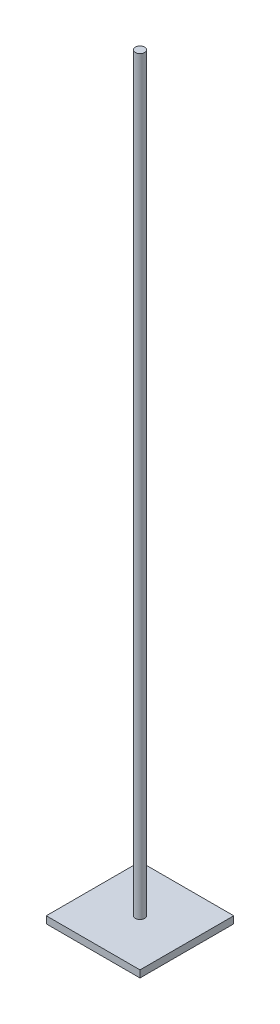
ISO-10303-21;
HEADER;
FILE_DESCRIPTION(('STEP AP214'),'2;1');
FILE_NAME('part.step','',(''),(''),'','','');
FILE_SCHEMA(('AUTOMOTIVE_DESIGN { 1 0 10303 214 1 1 1 1 }'));
ENDSEC;
DATA;
#1=APPLICATION_CONTEXT('core data for automotive mechanical design processes');
#2=APPLICATION_PROTOCOL_DEFINITION('international standard','automotive_design',2000,#1);
#3=PRODUCT_CONTEXT('',#1,'mechanical');
#4=PRODUCT('Part','Part','',(#3));
#5=PRODUCT_RELATED_PRODUCT_CATEGORY('part','',(#4));
#6=PRODUCT_DEFINITION_FORMATION('','',#4);
#7=PRODUCT_DEFINITION_CONTEXT('part definition',#1,'design');
#8=PRODUCT_DEFINITION('design','',#6,#7);
#9=PRODUCT_DEFINITION_SHAPE('','',#8);
#10=(LENGTH_UNIT() NAMED_UNIT(*) SI_UNIT(.MILLI.,.METRE.));
#11=(NAMED_UNIT(*) PLANE_ANGLE_UNIT() SI_UNIT($,.RADIAN.));
#12=(NAMED_UNIT(*) SI_UNIT($,.STERADIAN.) SOLID_ANGLE_UNIT());
#13=UNCERTAINTY_MEASURE_WITH_UNIT(LENGTH_MEASURE(1.E-05),#10,'distance_accuracy_value','');
#14=(GEOMETRIC_REPRESENTATION_CONTEXT(3) GLOBAL_UNCERTAINTY_ASSIGNED_CONTEXT((#13)) GLOBAL_UNIT_ASSIGNED_CONTEXT((#10,
#11,#12)) REPRESENTATION_CONTEXT('',''));
#15=CARTESIAN_POINT('',(0.,0.,0.));
#16=DIRECTION('',(0.,0.,1.));
#17=DIRECTION('',(1.,0.,0.));
#18=AXIS2_PLACEMENT_3D('',#15,#16,#17);
#19=CARTESIAN_POINT('',(100.,15.,100.));
#20=DIRECTION('',(-1.,0.,0.));
#21=DIRECTION('',(0.,0.,1.));
#22=AXIS2_PLACEMENT_3D('',#19,#20,#21);
#23=PLANE('',#22);
#24=DIRECTION('',(0.,0.,-1.));
#25=VECTOR('',#24,1.);
#26=CARTESIAN_POINT('',(100.,0.,100.));
#27=LINE('',#26,#25);
#28=CARTESIAN_POINT('',(100.,0.,100.));
#29=VERTEX_POINT('',#28);
#30=CARTESIAN_POINT('',(100.,0.,-100.));
#31=VERTEX_POINT('',#30);
#32=EDGE_CURVE('E99',#29,#31,#27,.T.);
#33=ORIENTED_EDGE('',*,*,#32,.T.);
#34=DIRECTION('',(0.,-1.,0.));
#35=VECTOR('',#34,1.);
#36=CARTESIAN_POINT('',(100.,15.,-100.));
#37=LINE('',#36,#35);
#38=CARTESIAN_POINT('',(100.,15.,-100.));
#39=VERTEX_POINT('',#38);
#40=EDGE_CURVE('E41',#39,#31,#37,.T.);
#41=ORIENTED_EDGE('',*,*,#40,.F.);
#42=DIRECTION('',(0.,0.,-1.));
#43=VECTOR('',#42,1.);
#44=CARTESIAN_POINT('',(100.,15.,100.));
#45=LINE('',#44,#43);
#46=CARTESIAN_POINT('',(100.,15.,100.));
#47=VERTEX_POINT('',#46);
#48=EDGE_CURVE('E85',#47,#39,#45,.T.);
#49=ORIENTED_EDGE('',*,*,#48,.F.);
#50=DIRECTION('',(0.,-1.,0.));
#51=VECTOR('',#50,1.);
#52=CARTESIAN_POINT('',(100.,15.,100.));
#53=LINE('',#52,#51);
#54=EDGE_CURVE('E95',#47,#29,#53,.T.);
#55=ORIENTED_EDGE('',*,*,#54,.T.);
#56=EDGE_LOOP('',(#33,#41,#49,#55));
#57=FACE_BOUND('',#56,.T.);
#58=ADVANCED_FACE('F33',(#57),#23,.F.);
#59=CARTESIAN_POINT('',(-100.,15.,-100.));
#60=DIRECTION('',(0.,0.,1.));
#61=DIRECTION('',(1.,0.,0.));
#62=AXIS2_PLACEMENT_3D('',#59,#60,#61);
#63=PLANE('',#62);
#64=DIRECTION('',(-1.,0.,0.));
#65=VECTOR('',#64,1.);
#66=CARTESIAN_POINT('',(-100.,0.,-100.));
#67=LINE('',#66,#65);
#68=CARTESIAN_POINT('',(-100.,0.,-100.));
#69=VERTEX_POINT('',#68);
#70=EDGE_CURVE('E90',#31,#69,#67,.T.);
#71=ORIENTED_EDGE('',*,*,#70,.T.);
#72=DIRECTION('',(0.,-1.,0.));
#73=VECTOR('',#72,1.);
#74=CARTESIAN_POINT('',(-100.,15.,-100.));
#75=LINE('',#74,#73);
#76=CARTESIAN_POINT('',(-100.,15.,-100.));
#77=VERTEX_POINT('',#76);
#78=EDGE_CURVE('E88',#77,#69,#75,.T.);
#79=ORIENTED_EDGE('',*,*,#78,.F.);
#80=DIRECTION('',(-1.,0.,0.));
#81=VECTOR('',#80,1.);
#82=CARTESIAN_POINT('',(-100.,15.,-100.));
#83=LINE('',#82,#81);
#84=EDGE_CURVE('E80',#39,#77,#83,.T.);
#85=ORIENTED_EDGE('',*,*,#84,.F.);
#86=ORIENTED_EDGE('',*,*,#40,.T.);
#87=EDGE_LOOP('',(#71,#79,#85,#86));
#88=FACE_BOUND('',#87,.T.);
#89=ADVANCED_FACE('F89',(#88),#63,.F.);
#90=CARTESIAN_POINT('',(-100.,15.,100.));
#91=DIRECTION('',(1.,0.,0.));
#92=DIRECTION('',(0.,0.,-1.));
#93=AXIS2_PLACEMENT_3D('',#90,#91,#92);
#94=PLANE('',#93);
#95=DIRECTION('',(0.,0.,1.));
#96=VECTOR('',#95,1.);
#97=CARTESIAN_POINT('',(-100.,0.,100.));
#98=LINE('',#97,#96);
#99=CARTESIAN_POINT('',(-100.,0.,100.));
#100=VERTEX_POINT('',#99);
#101=EDGE_CURVE('E66',#69,#100,#98,.T.);
#102=ORIENTED_EDGE('',*,*,#101,.T.);
#103=DIRECTION('',(0.,-1.,0.));
#104=VECTOR('',#103,1.);
#105=CARTESIAN_POINT('',(-100.,15.,100.));
#106=LINE('',#105,#104);
#107=CARTESIAN_POINT('',(-100.,15.,100.));
#108=VERTEX_POINT('',#107);
#109=EDGE_CURVE('E91',#108,#100,#106,.T.);
#110=ORIENTED_EDGE('',*,*,#109,.F.);
#111=DIRECTION('',(0.,0.,1.));
#112=VECTOR('',#111,1.);
#113=CARTESIAN_POINT('',(-100.,15.,100.));
#114=LINE('',#113,#112);
#115=EDGE_CURVE('E83',#77,#108,#114,.T.);
#116=ORIENTED_EDGE('',*,*,#115,.F.);
#117=ORIENTED_EDGE('',*,*,#78,.T.);
#118=EDGE_LOOP('',(#102,#110,#116,#117));
#119=FACE_BOUND('',#118,.T.);
#120=ADVANCED_FACE('F93',(#119),#94,.F.);
#121=CARTESIAN_POINT('',(-100.,15.,100.));
#122=DIRECTION('',(0.,0.,-1.));
#123=DIRECTION('',(-1.,0.,0.));
#124=AXIS2_PLACEMENT_3D('',#121,#122,#123);
#125=PLANE('',#124);
#126=DIRECTION('',(1.,0.,0.));
#127=VECTOR('',#126,1.);
#128=CARTESIAN_POINT('',(-100.,0.,100.));
#129=LINE('',#128,#127);
#130=EDGE_CURVE('E72',#100,#29,#129,.T.);
#131=ORIENTED_EDGE('',*,*,#130,.T.);
#132=ORIENTED_EDGE('',*,*,#54,.F.);
#133=DIRECTION('',(1.,0.,0.));
#134=VECTOR('',#133,1.);
#135=CARTESIAN_POINT('',(-100.,15.,100.));
#136=LINE('',#135,#134);
#137=EDGE_CURVE('E49',#108,#47,#136,.T.);
#138=ORIENTED_EDGE('',*,*,#137,.F.);
#139=ORIENTED_EDGE('',*,*,#109,.T.);
#140=EDGE_LOOP('',(#131,#132,#138,#139));
#141=FACE_BOUND('',#140,.T.);
#142=ADVANCED_FACE('F121',(#141),#125,.F.);
#143=CARTESIAN_POINT('',(0.,15.,0.));
#144=DIRECTION('',(0.,-1.,0.));
#145=DIRECTION('',(0.,0.,-1.));
#146=AXIS2_PLACEMENT_3D('',#143,#144,#145);
#147=PLANE('',#146);
#148=CARTESIAN_POINT('',(0.,14.9999999999999,0.));
#149=DIRECTION('',(0.,-1.,0.));
#150=DIRECTION('',(0.,0.,-1.));
#151=AXIS2_PLACEMENT_3D('',#148,#149,#150);
#152=CIRCLE('',#151,10.);
#153=CARTESIAN_POINT('',(0.,14.9999999999999,-10.));
#154=VERTEX_POINT('',#153);
#155=EDGE_CURVE('E11',#154,#154,#152,.F.);
#156=ORIENTED_EDGE('',*,*,#155,.F.);
#157=EDGE_LOOP('',(#156));
#158=FACE_BOUND('',#157,.T.);
#159=ORIENTED_EDGE('',*,*,#48,.T.);
#160=ORIENTED_EDGE('',*,*,#84,.T.);
#161=ORIENTED_EDGE('',*,*,#115,.T.);
#162=ORIENTED_EDGE('',*,*,#137,.T.);
#163=EDGE_LOOP('',(#159,#160,#161,#162));
#164=FACE_BOUND('',#163,.T.);
#165=ADVANCED_FACE('F81',(#158,#164),#147,.F.);
#166=CARTESIAN_POINT('',(0.,0.,0.));
#167=DIRECTION('',(0.,-1.,0.));
#168=DIRECTION('',(0.,0.,-1.));
#169=AXIS2_PLACEMENT_3D('',#166,#167,#168);
#170=PLANE('',#169);
#171=ORIENTED_EDGE('',*,*,#32,.F.);
#172=ORIENTED_EDGE('',*,*,#130,.F.);
#173=ORIENTED_EDGE('',*,*,#101,.F.);
#174=ORIENTED_EDGE('',*,*,#70,.F.);
#175=EDGE_LOOP('',(#171,#172,#173,#174));
#176=FACE_BOUND('',#175,.T.);
#177=ADVANCED_FACE('F110',(#176),#170,.T.);
#178=CARTESIAN_POINT('',(0.,1615.,0.));
#179=DIRECTION('',(0.,-1.,0.));
#180=DIRECTION('',(0.,0.,-1.));
#181=AXIS2_PLACEMENT_3D('',#178,#179,#180);
#182=CYLINDRICAL_SURFACE('',#181,10.);
#183=CARTESIAN_POINT('',(0.,1615.,0.));
#184=DIRECTION('',(0.,1.,0.));
#185=DIRECTION('',(0.,0.,1.));
#186=AXIS2_PLACEMENT_3D('',#183,#184,#185);
#187=CIRCLE('',#186,10.);
#188=CARTESIAN_POINT('',(0.,1615.,10.));
#189=VERTEX_POINT('',#188);
#190=EDGE_CURVE('E102',#189,#189,#187,.T.);
#191=ORIENTED_EDGE('',*,*,#190,.F.);
#192=EDGE_LOOP('',(#191));
#193=FACE_BOUND('',#192,.T.);
#194=ORIENTED_EDGE('',*,*,#155,.T.);
#195=EDGE_LOOP('',(#194));
#196=FACE_BOUND('',#195,.T.);
#197=ADVANCED_FACE('F112',(#193,#196),#182,.T.);
#198=CARTESIAN_POINT('',(0.,1615.,0.));
#199=DIRECTION('',(0.,1.,0.));
#200=DIRECTION('',(0.,0.,1.));
#201=AXIS2_PLACEMENT_3D('',#198,#199,#200);
#202=PLANE('',#201);
#203=ORIENTED_EDGE('',*,*,#190,.T.);
#204=EDGE_LOOP('',(#203));
#205=FACE_BOUND('',#204,.T.);
#206=ADVANCED_FACE('F118',(#205),#202,.T.);
#207=CLOSED_SHELL('',(#58,#89,#120,#142,#165,#177,#197,#206));
#208=MANIFOLD_SOLID_BREP('B2',#207);
#209=ADVANCED_BREP_SHAPE_REPRESENTATION('',(#18,#208),#14);
#210=SHAPE_DEFINITION_REPRESENTATION(#9,#209);
ENDSEC;
END-ISO-10303-21;
